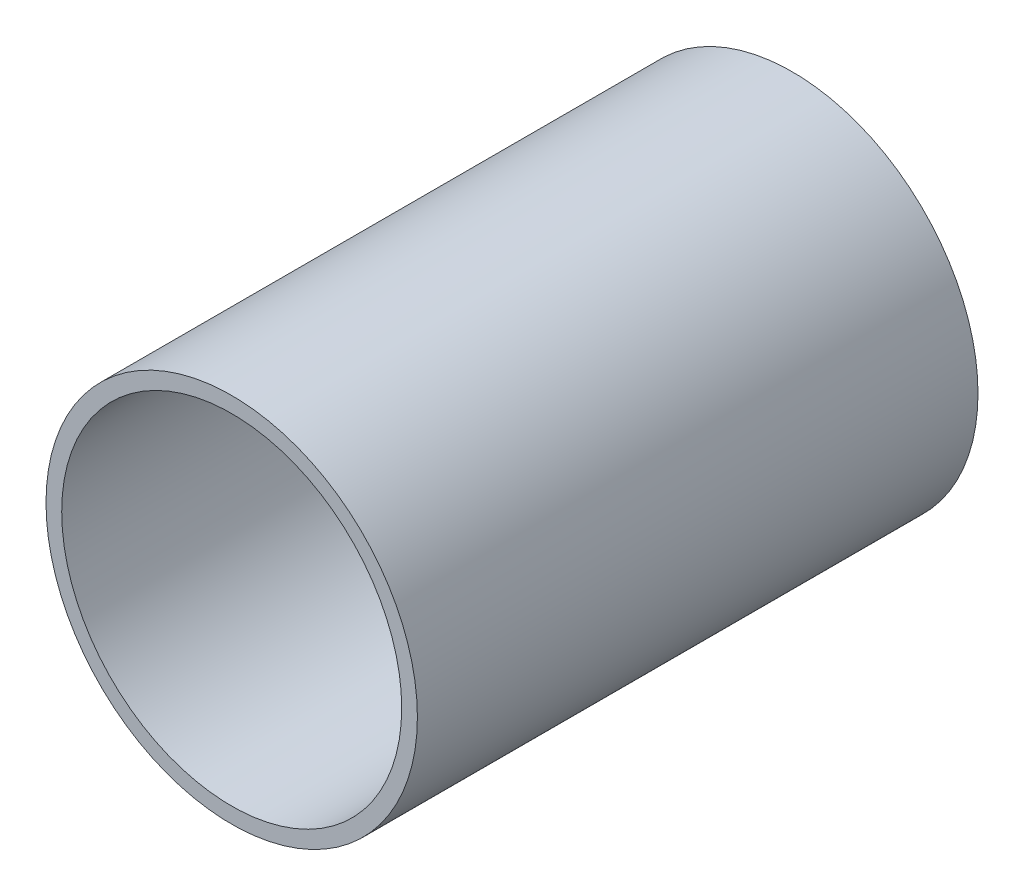
ISO-10303-21;
HEADER;
FILE_DESCRIPTION(('STEP AP214'),'2;1');
FILE_NAME('part.step','',(''),(''),'','','');
FILE_SCHEMA(('AUTOMOTIVE_DESIGN { 1 0 10303 214 1 1 1 1 }'));
ENDSEC;
DATA;
#1=APPLICATION_CONTEXT('core data for automotive mechanical design processes');
#2=APPLICATION_PROTOCOL_DEFINITION('international standard','automotive_design',2000,#1);
#3=PRODUCT_CONTEXT('',#1,'mechanical');
#4=PRODUCT('Part','Part','',(#3));
#5=PRODUCT_RELATED_PRODUCT_CATEGORY('part','',(#4));
#6=PRODUCT_DEFINITION_FORMATION('','',#4);
#7=PRODUCT_DEFINITION_CONTEXT('part definition',#1,'design');
#8=PRODUCT_DEFINITION('design','',#6,#7);
#9=PRODUCT_DEFINITION_SHAPE('','',#8);
#10=(LENGTH_UNIT() NAMED_UNIT(*) SI_UNIT(.MILLI.,.METRE.));
#11=(NAMED_UNIT(*) PLANE_ANGLE_UNIT() SI_UNIT($,.RADIAN.));
#12=(NAMED_UNIT(*) SI_UNIT($,.STERADIAN.) SOLID_ANGLE_UNIT());
#13=UNCERTAINTY_MEASURE_WITH_UNIT(LENGTH_MEASURE(1.E-05),#10,'distance_accuracy_value','');
#14=(GEOMETRIC_REPRESENTATION_CONTEXT(3) GLOBAL_UNCERTAINTY_ASSIGNED_CONTEXT((#13)) GLOBAL_UNIT_ASSIGNED_CONTEXT((#10,
#11,#12)) REPRESENTATION_CONTEXT('',''));
#15=CARTESIAN_POINT('',(0.,0.,0.));
#16=DIRECTION('',(0.,0.,1.));
#17=DIRECTION('',(1.,0.,0.));
#18=AXIS2_PLACEMENT_3D('',#15,#16,#17);
#19=CARTESIAN_POINT('',(0.,0.,127.));
#20=DIRECTION('',(0.,0.,1.));
#21=DIRECTION('',(1.,0.,0.));
#22=AXIS2_PLACEMENT_3D('',#19,#20,#21);
#23=PLANE('',#22);
#24=CARTESIAN_POINT('',(0.,0.,127.));
#25=DIRECTION('',(0.,0.,1.));
#26=DIRECTION('',(1.,0.,0.));
#27=AXIS2_PLACEMENT_3D('',#24,#25,#26);
#28=CIRCLE('',#27,84.1375);
#29=CARTESIAN_POINT('',(84.1375,0.,127.));
#30=VERTEX_POINT('',#29);
#31=EDGE_CURVE('E10',#30,#30,#28,.T.);
#32=ORIENTED_EDGE('',*,*,#31,.T.);
#33=EDGE_LOOP('',(#32));
#34=FACE_BOUND('',#33,.T.);
#35=CARTESIAN_POINT('',(0.,0.,127.));
#36=DIRECTION('',(0.,0.,1.));
#37=DIRECTION('',(1.,0.,0.));
#38=AXIS2_PLACEMENT_3D('',#35,#36,#37);
#39=CIRCLE('',#38,77.0255);
#40=CARTESIAN_POINT('',(77.0255,0.,127.));
#41=VERTEX_POINT('',#40);
#42=EDGE_CURVE('E42',#41,#41,#39,.T.);
#43=ORIENTED_EDGE('',*,*,#42,.F.);
#44=EDGE_LOOP('',(#43));
#45=FACE_BOUND('',#44,.T.);
#46=ADVANCED_FACE('F31',(#34,#45),#23,.T.);
#47=CARTESIAN_POINT('',(0.,0.,-127.));
#48=DIRECTION('',(0.,0.,1.));
#49=DIRECTION('',(1.,0.,0.));
#50=AXIS2_PLACEMENT_3D('',#47,#48,#49);
#51=PLANE('',#50);
#52=CARTESIAN_POINT('',(0.,0.,-127.));
#53=DIRECTION('',(0.,0.,1.));
#54=DIRECTION('',(1.,0.,0.));
#55=AXIS2_PLACEMENT_3D('',#52,#53,#54);
#56=CIRCLE('',#55,84.1375);
#57=CARTESIAN_POINT('',(84.1375,0.,-127.));
#58=VERTEX_POINT('',#57);
#59=EDGE_CURVE('E35',#58,#58,#56,.T.);
#60=ORIENTED_EDGE('',*,*,#59,.F.);
#61=EDGE_LOOP('',(#60));
#62=FACE_BOUND('',#61,.T.);
#63=CARTESIAN_POINT('',(0.,0.,-127.));
#64=DIRECTION('',(0.,0.,1.));
#65=DIRECTION('',(1.,0.,0.));
#66=AXIS2_PLACEMENT_3D('',#63,#64,#65);
#67=CIRCLE('',#66,77.0255);
#68=CARTESIAN_POINT('',(77.0255,0.,-127.));
#69=VERTEX_POINT('',#68);
#70=EDGE_CURVE('E44',#69,#69,#67,.T.);
#71=ORIENTED_EDGE('',*,*,#70,.T.);
#72=EDGE_LOOP('',(#71));
#73=FACE_BOUND('',#72,.T.);
#74=ADVANCED_FACE('F54',(#62,#73),#51,.F.);
#75=CARTESIAN_POINT('',(0.,0.,127.));
#76=DIRECTION('',(0.,0.,-1.));
#77=DIRECTION('',(-1.,0.,0.));
#78=AXIS2_PLACEMENT_3D('',#75,#76,#77);
#79=CYLINDRICAL_SURFACE('',#78,84.1375);
#80=ORIENTED_EDGE('',*,*,#31,.F.);
#81=EDGE_LOOP('',(#80));
#82=FACE_BOUND('',#81,.T.);
#83=ORIENTED_EDGE('',*,*,#59,.T.);
#84=EDGE_LOOP('',(#83));
#85=FACE_BOUND('',#84,.T.);
#86=ADVANCED_FACE('F33',(#82,#85),#79,.T.);
#87=CARTESIAN_POINT('',(0.,0.,127.));
#88=DIRECTION('',(0.,0.,-1.));
#89=DIRECTION('',(-1.,0.,0.));
#90=AXIS2_PLACEMENT_3D('',#87,#88,#89);
#91=CYLINDRICAL_SURFACE('',#90,77.0255);
#92=ORIENTED_EDGE('',*,*,#42,.T.);
#93=EDGE_LOOP('',(#92));
#94=FACE_BOUND('',#93,.T.);
#95=ORIENTED_EDGE('',*,*,#70,.F.);
#96=EDGE_LOOP('',(#95));
#97=FACE_BOUND('',#96,.T.);
#98=ADVANCED_FACE('F50',(#94,#97),#91,.F.);
#99=CLOSED_SHELL('',(#46,#74,#86,#98));
#100=MANIFOLD_SOLID_BREP('B2',#99);
#101=ADVANCED_BREP_SHAPE_REPRESENTATION('',(#18,#100),#14);
#102=SHAPE_DEFINITION_REPRESENTATION(#9,#101);
ENDSEC;
END-ISO-10303-21;
